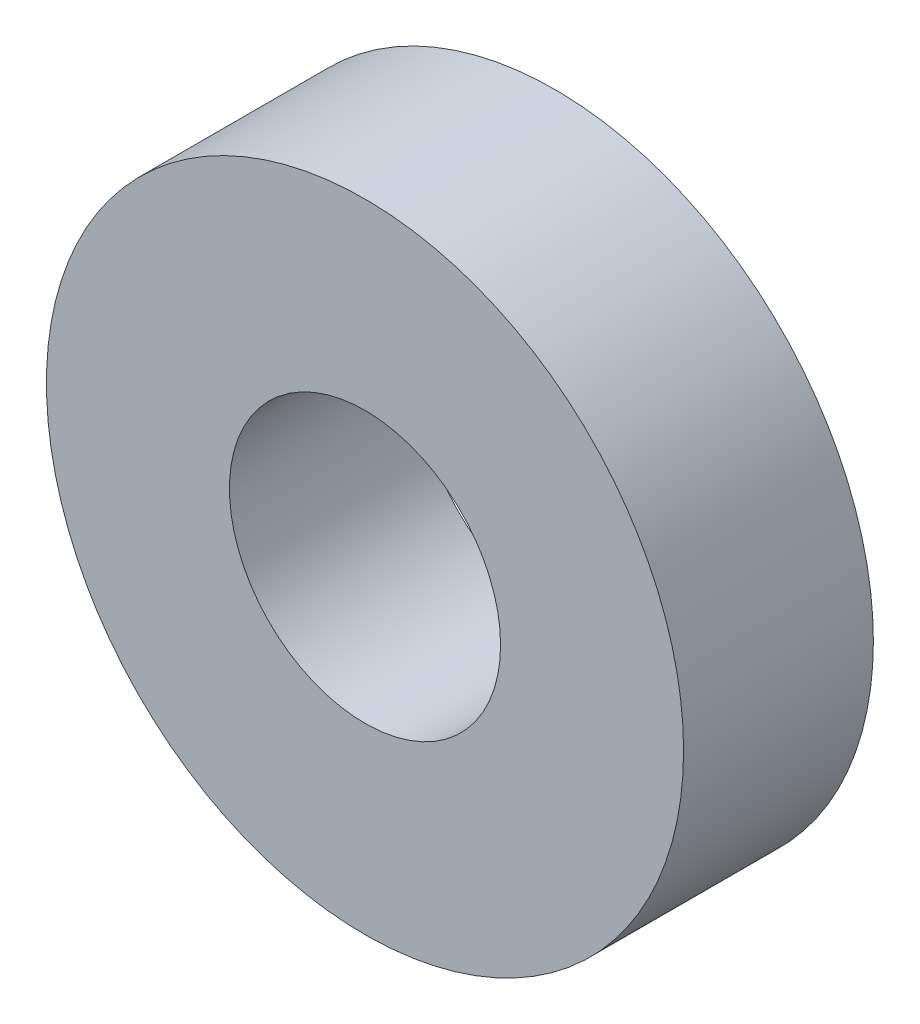
ISO-10303-21;
HEADER;
FILE_DESCRIPTION(('STEP AP214'),'2;1');
FILE_NAME('part.step','',(''),(''),'','','');
FILE_SCHEMA(('AUTOMOTIVE_DESIGN { 1 0 10303 214 1 1 1 1 }'));
ENDSEC;
DATA;
#1=APPLICATION_CONTEXT('core data for automotive mechanical design processes');
#2=APPLICATION_PROTOCOL_DEFINITION('international standard','automotive_design',2000,#1);
#3=PRODUCT_CONTEXT('',#1,'mechanical');
#4=PRODUCT('Part','Part','',(#3));
#5=PRODUCT_RELATED_PRODUCT_CATEGORY('part','',(#4));
#6=PRODUCT_DEFINITION_FORMATION('','',#4);
#7=PRODUCT_DEFINITION_CONTEXT('part definition',#1,'design');
#8=PRODUCT_DEFINITION('design','',#6,#7);
#9=PRODUCT_DEFINITION_SHAPE('','',#8);
#10=(LENGTH_UNIT() NAMED_UNIT(*) SI_UNIT(.MILLI.,.METRE.));
#11=(NAMED_UNIT(*) PLANE_ANGLE_UNIT() SI_UNIT($,.RADIAN.));
#12=(NAMED_UNIT(*) SI_UNIT($,.STERADIAN.) SOLID_ANGLE_UNIT());
#13=UNCERTAINTY_MEASURE_WITH_UNIT(LENGTH_MEASURE(1.E-05),#10,'distance_accuracy_value','');
#14=(GEOMETRIC_REPRESENTATION_CONTEXT(3) GLOBAL_UNCERTAINTY_ASSIGNED_CONTEXT((#13)) GLOBAL_UNIT_ASSIGNED_CONTEXT((#10,
#11,#12)) REPRESENTATION_CONTEXT('',''));
#15=CARTESIAN_POINT('',(0.,0.,0.));
#16=DIRECTION('',(0.,0.,1.));
#17=DIRECTION('',(1.,0.,0.));
#18=AXIS2_PLACEMENT_3D('',#15,#16,#17);
#19=CARTESIAN_POINT('',(0.,0.,-31.));
#20=DIRECTION('',(0.,0.,1.));
#21=DIRECTION('',(1.,0.,0.));
#22=AXIS2_PLACEMENT_3D('',#19,#20,#21);
#23=PLANE('',#22);
#24=CARTESIAN_POINT('',(0.,0.,-31.));
#25=DIRECTION('',(0.,0.,1.));
#26=DIRECTION('',(1.,0.,0.));
#27=AXIS2_PLACEMENT_3D('',#24,#25,#26);
#28=CIRCLE('',#27,23.5);
#29=CARTESIAN_POINT('',(23.5,0.,-31.));
#30=VERTEX_POINT('',#29);
#31=EDGE_CURVE('E10',#30,#30,#28,.T.);
#32=ORIENTED_EDGE('',*,*,#31,.T.);
#33=EDGE_LOOP('',(#32));
#34=FACE_BOUND('',#33,.T.);
#35=CARTESIAN_POINT('',(0.,0.,-31.));
#36=DIRECTION('',(0.,0.,1.));
#37=DIRECTION('',(1.,0.,0.));
#38=AXIS2_PLACEMENT_3D('',#35,#36,#37);
#39=CIRCLE('',#38,10.);
#40=CARTESIAN_POINT('',(10.,0.,-31.));
#41=VERTEX_POINT('',#40);
#42=EDGE_CURVE('E46',#41,#41,#39,.T.);
#43=ORIENTED_EDGE('',*,*,#42,.F.);
#44=EDGE_LOOP('',(#43));
#45=FACE_BOUND('',#44,.T.);
#46=ADVANCED_FACE('F35',(#34,#45),#23,.T.);
#47=CARTESIAN_POINT('',(0.,0.,-45.));
#48=DIRECTION('',(0.,0.,1.));
#49=DIRECTION('',(1.,0.,0.));
#50=AXIS2_PLACEMENT_3D('',#47,#48,#49);
#51=PLANE('',#50);
#52=CARTESIAN_POINT('',(0.,0.,-45.));
#53=DIRECTION('',(0.,0.,1.));
#54=DIRECTION('',(1.,0.,0.));
#55=AXIS2_PLACEMENT_3D('',#52,#53,#54);
#56=CIRCLE('',#55,23.5);
#57=CARTESIAN_POINT('',(23.5,0.,-45.));
#58=VERTEX_POINT('',#57);
#59=EDGE_CURVE('E39',#58,#58,#56,.T.);
#60=ORIENTED_EDGE('',*,*,#59,.F.);
#61=EDGE_LOOP('',(#60));
#62=FACE_BOUND('',#61,.T.);
#63=CARTESIAN_POINT('',(0.,0.,-45.));
#64=DIRECTION('',(0.,0.,1.));
#65=DIRECTION('',(1.,0.,0.));
#66=AXIS2_PLACEMENT_3D('',#63,#64,#65);
#67=CIRCLE('',#66,10.);
#68=CARTESIAN_POINT('',(10.,0.,-45.));
#69=VERTEX_POINT('',#68);
#70=EDGE_CURVE('E48',#69,#69,#67,.T.);
#71=ORIENTED_EDGE('',*,*,#70,.T.);
#72=EDGE_LOOP('',(#71));
#73=FACE_BOUND('',#72,.T.);
#74=ADVANCED_FACE('F58',(#62,#73),#51,.F.);
#75=CARTESIAN_POINT('',(0.,0.,-31.));
#76=DIRECTION('',(0.,0.,-1.));
#77=DIRECTION('',(-1.,0.,0.));
#78=AXIS2_PLACEMENT_3D('',#75,#76,#77);
#79=CYLINDRICAL_SURFACE('',#78,23.5);
#80=ORIENTED_EDGE('',*,*,#31,.F.);
#81=EDGE_LOOP('',(#80));
#82=FACE_BOUND('',#81,.T.);
#83=ORIENTED_EDGE('',*,*,#59,.T.);
#84=EDGE_LOOP('',(#83));
#85=FACE_BOUND('',#84,.T.);
#86=ADVANCED_FACE('F37',(#82,#85),#79,.T.);
#87=CARTESIAN_POINT('',(0.,0.,-31.));
#88=DIRECTION('',(0.,0.,-1.));
#89=DIRECTION('',(-1.,0.,0.));
#90=AXIS2_PLACEMENT_3D('',#87,#88,#89);
#91=CYLINDRICAL_SURFACE('',#90,10.);
#92=ORIENTED_EDGE('',*,*,#42,.T.);
#93=EDGE_LOOP('',(#92));
#94=FACE_BOUND('',#93,.T.);
#95=ORIENTED_EDGE('',*,*,#70,.F.);
#96=EDGE_LOOP('',(#95));
#97=FACE_BOUND('',#96,.T.);
#98=ADVANCED_FACE('F54',(#94,#97),#91,.F.);
#99=CLOSED_SHELL('',(#46,#74,#86,#98));
#100=MANIFOLD_SOLID_BREP('B2',#99);
#101=ADVANCED_BREP_SHAPE_REPRESENTATION('',(#18,#100),#14);
#102=SHAPE_DEFINITION_REPRESENTATION(#9,#101);
ENDSEC;
END-ISO-10303-21;
